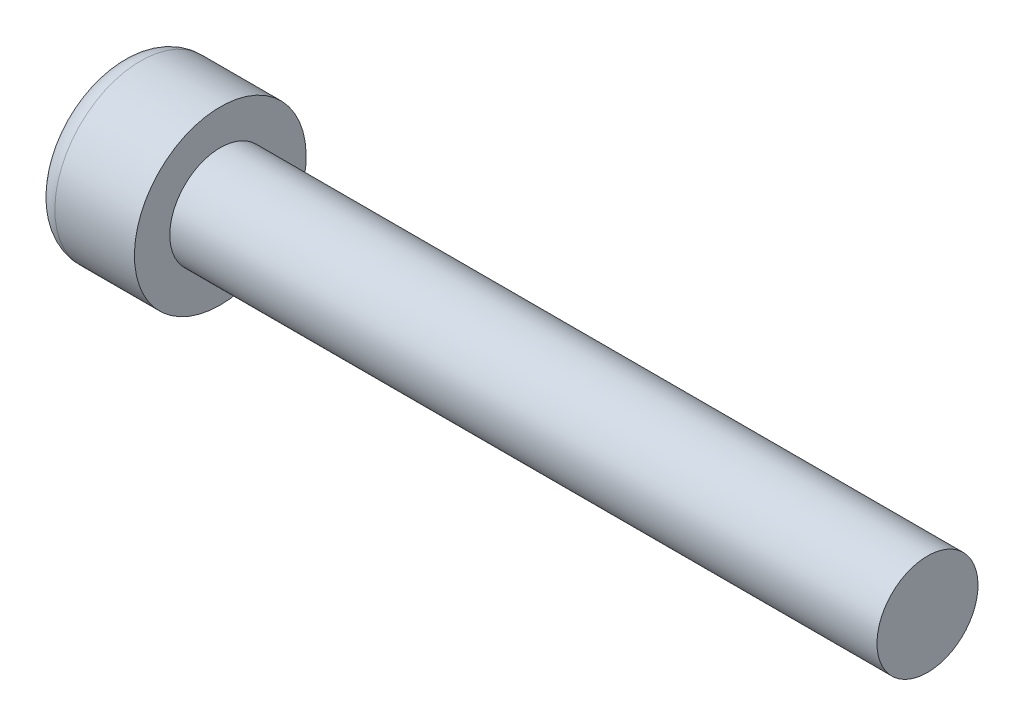
ISO-10303-21;
HEADER;
FILE_DESCRIPTION(('STEP AP214'),'2;1');
FILE_NAME('part.step','',(''),(''),'','','');
FILE_SCHEMA(('AUTOMOTIVE_DESIGN { 1 0 10303 214 1 1 1 1 }'));
ENDSEC;
DATA;
#1=APPLICATION_CONTEXT('core data for automotive mechanical design processes');
#2=APPLICATION_PROTOCOL_DEFINITION('international standard','automotive_design',2000,#1);
#3=PRODUCT_CONTEXT('',#1,'mechanical');
#4=PRODUCT('Part','Part','',(#3));
#5=PRODUCT_RELATED_PRODUCT_CATEGORY('part','',(#4));
#6=PRODUCT_DEFINITION_FORMATION('','',#4);
#7=PRODUCT_DEFINITION_CONTEXT('part definition',#1,'design');
#8=PRODUCT_DEFINITION('design','',#6,#7);
#9=PRODUCT_DEFINITION_SHAPE('','',#8);
#10=(LENGTH_UNIT() NAMED_UNIT(*) SI_UNIT(.MILLI.,.METRE.));
#11=(NAMED_UNIT(*) PLANE_ANGLE_UNIT() SI_UNIT($,.RADIAN.));
#12=(NAMED_UNIT(*) SI_UNIT($,.STERADIAN.) SOLID_ANGLE_UNIT());
#13=UNCERTAINTY_MEASURE_WITH_UNIT(LENGTH_MEASURE(1.E-05),#10,'distance_accuracy_value','');
#14=(GEOMETRIC_REPRESENTATION_CONTEXT(3) GLOBAL_UNCERTAINTY_ASSIGNED_CONTEXT((#13)) GLOBAL_UNIT_ASSIGNED_CONTEXT((#10,
#11,#12)) REPRESENTATION_CONTEXT('',''));
#15=CARTESIAN_POINT('',(0.,0.,0.));
#16=DIRECTION('',(0.,0.,1.));
#17=DIRECTION('',(1.,0.,0.));
#18=AXIS2_PLACEMENT_3D('',#15,#16,#17);
#19=CARTESIAN_POINT('',(0.,0.,0.));
#20=DIRECTION('',(1.,0.,0.));
#21=DIRECTION('',(0.,1.,0.));
#22=AXIS2_PLACEMENT_3D('',#19,#20,#21);
#23=PLANE('',#22);
#24=DIRECTION('',(0.,-0.5,-0.866025403784439));
#25=VECTOR('',#24,1.);
#26=CARTESIAN_POINT('',(0.,2.3094010767585,0.));
#27=LINE('',#26,#25);
#28=CARTESIAN_POINT('',(0.,2.3094010767585,0.));
#29=VERTEX_POINT('',#28);
#30=CARTESIAN_POINT('',(0.,1.15470053837925,-2.));
#31=VERTEX_POINT('',#30);
#32=EDGE_CURVE('E121',#29,#31,#27,.T.);
#33=ORIENTED_EDGE('',*,*,#32,.F.);
#34=DIRECTION('',(0.,0.5,-0.866025403784439));
#35=VECTOR('',#34,1.);
#36=CARTESIAN_POINT('',(0.,1.15470053837925,2.));
#37=LINE('',#36,#35);
#38=CARTESIAN_POINT('',(0.,1.15470053837925,2.));
#39=VERTEX_POINT('',#38);
#40=EDGE_CURVE('E47',#39,#29,#37,.T.);
#41=ORIENTED_EDGE('',*,*,#40,.F.);
#42=DIRECTION('',(0.,1.,0.));
#43=VECTOR('',#42,1.);
#44=CARTESIAN_POINT('',(0.,-1.15470053837925,2.));
#45=LINE('',#44,#43);
#46=CARTESIAN_POINT('',(0.,-1.15470053837925,2.));
#47=VERTEX_POINT('',#46);
#48=EDGE_CURVE('E130',#47,#39,#45,.T.);
#49=ORIENTED_EDGE('',*,*,#48,.F.);
#50=DIRECTION('',(0.,0.5,0.866025403784439));
#51=VECTOR('',#50,1.);
#52=CARTESIAN_POINT('',(0.,-2.3094010767585,0.));
#53=LINE('',#52,#51);
#54=CARTESIAN_POINT('',(0.,-2.3094010767585,0.));
#55=VERTEX_POINT('',#54);
#56=EDGE_CURVE('E128',#55,#47,#53,.T.);
#57=ORIENTED_EDGE('',*,*,#56,.F.);
#58=DIRECTION('',(0.,-0.5,0.866025403784439));
#59=VECTOR('',#58,1.);
#60=CARTESIAN_POINT('',(0.,-1.15470053837925,-2.));
#61=LINE('',#60,#59);
#62=CARTESIAN_POINT('',(0.,-1.15470053837925,-2.));
#63=VERTEX_POINT('',#62);
#64=EDGE_CURVE('E95',#63,#55,#61,.T.);
#65=ORIENTED_EDGE('',*,*,#64,.F.);
#66=DIRECTION('',(0.,-1.,0.));
#67=VECTOR('',#66,1.);
#68=CARTESIAN_POINT('',(0.,1.15470053837925,-2.));
#69=LINE('',#68,#67);
#70=EDGE_CURVE('E124',#31,#63,#69,.T.);
#71=ORIENTED_EDGE('',*,*,#70,.F.);
#72=EDGE_LOOP('',(#33,#41,#49,#57,#65,#71));
#73=FACE_BOUND('',#72,.T.);
#74=CARTESIAN_POINT('',(0.,0.,0.));
#75=DIRECTION('',(-1.,0.,0.));
#76=DIRECTION('',(0.,-1.,0.));
#77=AXIS2_PLACEMENT_3D('',#74,#75,#76);
#78=CIRCLE('',#77,3.1875);
#79=CARTESIAN_POINT('',(0.,-3.1875,0.));
#80=VERTEX_POINT('',#79);
#81=EDGE_CURVE('E11',#80,#80,#78,.T.);
#82=ORIENTED_EDGE('',*,*,#81,.T.);
#83=EDGE_LOOP('',(#82));
#84=FACE_BOUND('',#83,.T.);
#85=ADVANCED_FACE('F33',(#73,#84),#23,.F.);
#86=CARTESIAN_POINT('',(1.0625,0.,0.));
#87=DIRECTION('',(-1.,0.,0.));
#88=DIRECTION('',(0.,-1.,0.));
#89=AXIS2_PLACEMENT_3D('',#86,#87,#88);
#90=TOROIDAL_SURFACE('',#89,3.1875,1.0625);
#91=ORIENTED_EDGE('',*,*,#81,.F.);
#92=EDGE_LOOP('',(#91));
#93=FACE_BOUND('',#92,.T.);
#94=CARTESIAN_POINT('',(1.0625,0.,0.));
#95=DIRECTION('',(-1.,0.,0.));
#96=DIRECTION('',(0.,-1.,0.));
#97=AXIS2_PLACEMENT_3D('',#94,#95,#96);
#98=CIRCLE('',#97,4.25);
#99=CARTESIAN_POINT('',(1.0625,-4.25,0.));
#100=VERTEX_POINT('',#99);
#101=EDGE_CURVE('E40',#100,#100,#98,.T.);
#102=ORIENTED_EDGE('',*,*,#101,.T.);
#103=EDGE_LOOP('',(#102));
#104=FACE_BOUND('',#103,.T.);
#105=ADVANCED_FACE('F150',(#93,#104),#90,.T.);
#106=CARTESIAN_POINT('',(0.,0.,0.));
#107=DIRECTION('',(-1.,0.,0.));
#108=DIRECTION('',(0.,-1.,0.));
#109=AXIS2_PLACEMENT_3D('',#106,#107,#108);
#110=CYLINDRICAL_SURFACE('',#109,4.25);
#111=ORIENTED_EDGE('',*,*,#101,.F.);
#112=EDGE_LOOP('',(#111));
#113=FACE_BOUND('',#112,.T.);
#114=CARTESIAN_POINT('',(5.,0.,0.));
#115=DIRECTION('',(-1.,0.,0.));
#116=DIRECTION('',(0.,-1.,0.));
#117=AXIS2_PLACEMENT_3D('',#114,#115,#116);
#118=CIRCLE('',#117,4.25);
#119=CARTESIAN_POINT('',(5.,-4.25,0.));
#120=VERTEX_POINT('',#119);
#121=EDGE_CURVE('E145',#120,#120,#118,.T.);
#122=ORIENTED_EDGE('',*,*,#121,.T.);
#123=EDGE_LOOP('',(#122));
#124=FACE_BOUND('',#123,.T.);
#125=ADVANCED_FACE('F152',(#113,#124),#110,.T.);
#126=CARTESIAN_POINT('',(5.,4.25,0.));
#127=DIRECTION('',(-1.,0.,0.));
#128=DIRECTION('',(0.,-1.,0.));
#129=AXIS2_PLACEMENT_3D('',#126,#127,#128);
#130=PLANE('',#129);
#131=ORIENTED_EDGE('',*,*,#121,.F.);
#132=EDGE_LOOP('',(#131));
#133=FACE_BOUND('',#132,.T.);
#134=CARTESIAN_POINT('',(5.,0.,0.));
#135=DIRECTION('',(-1.,0.,0.));
#136=DIRECTION('',(0.,-1.,0.));
#137=AXIS2_PLACEMENT_3D('',#134,#135,#136);
#138=CIRCLE('',#137,2.5);
#139=CARTESIAN_POINT('',(5.,-2.5,0.));
#140=VERTEX_POINT('',#139);
#141=EDGE_CURVE('E142',#140,#140,#138,.T.);
#142=ORIENTED_EDGE('',*,*,#141,.T.);
#143=EDGE_LOOP('',(#142));
#144=FACE_BOUND('',#143,.T.);
#145=ADVANCED_FACE('F155',(#133,#144),#130,.F.);
#146=CARTESIAN_POINT('',(0.,0.,0.));
#147=DIRECTION('',(-1.,0.,0.));
#148=DIRECTION('',(0.,-1.,0.));
#149=AXIS2_PLACEMENT_3D('',#146,#147,#148);
#150=CYLINDRICAL_SURFACE('',#149,2.49999999999999);
#151=ORIENTED_EDGE('',*,*,#141,.F.);
#152=EDGE_LOOP('',(#151));
#153=FACE_BOUND('',#152,.T.);
#154=CARTESIAN_POINT('',(40.,0.,0.));
#155=DIRECTION('',(-1.,0.,0.));
#156=DIRECTION('',(0.,-1.,0.));
#157=AXIS2_PLACEMENT_3D('',#154,#155,#156);
#158=CIRCLE('',#157,2.49999999999999);
#159=CARTESIAN_POINT('',(40.,-2.49999999999999,0.));
#160=VERTEX_POINT('',#159);
#161=EDGE_CURVE('E134',#160,#160,#158,.T.);
#162=ORIENTED_EDGE('',*,*,#161,.T.);
#163=EDGE_LOOP('',(#162));
#164=FACE_BOUND('',#163,.T.);
#165=ADVANCED_FACE('F161',(#153,#164),#150,.T.);
#166=CARTESIAN_POINT('',(40.,2.5,0.));
#167=DIRECTION('',(-1.,0.,0.));
#168=DIRECTION('',(0.,-1.,0.));
#169=AXIS2_PLACEMENT_3D('',#166,#167,#168);
#170=PLANE('',#169);
#171=ORIENTED_EDGE('',*,*,#161,.F.);
#172=EDGE_LOOP('',(#171));
#173=FACE_BOUND('',#172,.T.);
#174=ADVANCED_FACE('F167',(#173),#170,.F.);
#175=CARTESIAN_POINT('',(2.5,1.15470053837925,2.));
#176=DIRECTION('',(0.,0.866025403784439,0.5));
#177=DIRECTION('',(0.,-0.5,0.866025403784439));
#178=AXIS2_PLACEMENT_3D('',#175,#176,#177);
#179=PLANE('',#178);
#180=ORIENTED_EDGE('',*,*,#40,.T.);
#181=DIRECTION('',(-1.,0.,0.));
#182=VECTOR('',#181,1.);
#183=CARTESIAN_POINT('',(2.5,2.3094010767585,0.));
#184=LINE('',#183,#182);
#185=CARTESIAN_POINT('',(2.5,2.3094010767585,0.));
#186=VERTEX_POINT('',#185);
#187=EDGE_CURVE('E77',#186,#29,#184,.T.);
#188=ORIENTED_EDGE('',*,*,#187,.F.);
#189=DIRECTION('',(0.,0.5,-0.866025403784439));
#190=VECTOR('',#189,1.);
#191=CARTESIAN_POINT('',(2.5,1.15470053837925,2.));
#192=LINE('',#191,#190);
#193=CARTESIAN_POINT('',(2.5,1.15470053837925,2.));
#194=VERTEX_POINT('',#193);
#195=EDGE_CURVE('E132',#194,#186,#192,.T.);
#196=ORIENTED_EDGE('',*,*,#195,.F.);
#197=DIRECTION('',(-1.,0.,0.));
#198=VECTOR('',#197,1.);
#199=CARTESIAN_POINT('',(2.5,1.15470053837925,2.));
#200=LINE('',#199,#198);
#201=EDGE_CURVE('E55',#194,#39,#200,.T.);
#202=ORIENTED_EDGE('',*,*,#201,.T.);
#203=EDGE_LOOP('',(#180,#188,#196,#202));
#204=FACE_BOUND('',#203,.T.);
#205=ADVANCED_FACE('F172',(#204),#179,.F.);
#206=CARTESIAN_POINT('',(2.5,-1.15470053837925,2.));
#207=DIRECTION('',(0.,0.,1.));
#208=DIRECTION('',(1.,0.,0.));
#209=AXIS2_PLACEMENT_3D('',#206,#207,#208);
#210=PLANE('',#209);
#211=ORIENTED_EDGE('',*,*,#48,.T.);
#212=ORIENTED_EDGE('',*,*,#201,.F.);
#213=DIRECTION('',(0.,1.,0.));
#214=VECTOR('',#213,1.);
#215=CARTESIAN_POINT('',(2.5,-1.15470053837925,2.));
#216=LINE('',#215,#214);
#217=CARTESIAN_POINT('',(2.5,-1.15470053837925,2.));
#218=VERTEX_POINT('',#217);
#219=EDGE_CURVE('E107',#218,#194,#216,.T.);
#220=ORIENTED_EDGE('',*,*,#219,.F.);
#221=DIRECTION('',(-1.,0.,0.));
#222=VECTOR('',#221,1.);
#223=CARTESIAN_POINT('',(2.5,-1.15470053837925,2.));
#224=LINE('',#223,#222);
#225=EDGE_CURVE('E99',#218,#47,#224,.T.);
#226=ORIENTED_EDGE('',*,*,#225,.T.);
#227=EDGE_LOOP('',(#211,#212,#220,#226));
#228=FACE_BOUND('',#227,.T.);
#229=ADVANCED_FACE('F177',(#228),#210,.F.);
#230=CARTESIAN_POINT('',(2.5,-2.3094010767585,0.));
#231=DIRECTION('',(0.,-0.866025403784439,0.5));
#232=DIRECTION('',(0.,-0.5,-0.866025403784439));
#233=AXIS2_PLACEMENT_3D('',#230,#231,#232);
#234=PLANE('',#233);
#235=ORIENTED_EDGE('',*,*,#56,.T.);
#236=ORIENTED_EDGE('',*,*,#225,.F.);
#237=DIRECTION('',(0.,0.5,0.866025403784439));
#238=VECTOR('',#237,1.);
#239=CARTESIAN_POINT('',(2.5,-2.3094010767585,0.));
#240=LINE('',#239,#238);
#241=CARTESIAN_POINT('',(2.5,-2.3094010767585,0.));
#242=VERTEX_POINT('',#241);
#243=EDGE_CURVE('E103',#242,#218,#240,.T.);
#244=ORIENTED_EDGE('',*,*,#243,.F.);
#245=DIRECTION('',(-1.,0.,0.));
#246=VECTOR('',#245,1.);
#247=CARTESIAN_POINT('',(2.5,-2.3094010767585,0.));
#248=LINE('',#247,#246);
#249=EDGE_CURVE('E88',#242,#55,#248,.T.);
#250=ORIENTED_EDGE('',*,*,#249,.T.);
#251=EDGE_LOOP('',(#235,#236,#244,#250));
#252=FACE_BOUND('',#251,.T.);
#253=ADVANCED_FACE('F104',(#252),#234,.F.);
#254=CARTESIAN_POINT('',(2.5,-1.15470053837925,-2.));
#255=DIRECTION('',(0.,-0.866025403784438,-0.5));
#256=DIRECTION('',(0.,0.5,-0.866025403784438));
#257=AXIS2_PLACEMENT_3D('',#254,#255,#256);
#258=PLANE('',#257);
#259=ORIENTED_EDGE('',*,*,#64,.T.);
#260=ORIENTED_EDGE('',*,*,#249,.F.);
#261=DIRECTION('',(0.,-0.5,0.866025403784439));
#262=VECTOR('',#261,1.);
#263=CARTESIAN_POINT('',(2.5,-1.15470053837925,-2.));
#264=LINE('',#263,#262);
#265=CARTESIAN_POINT('',(2.5,-1.15470053837925,-2.));
#266=VERTEX_POINT('',#265);
#267=EDGE_CURVE('E92',#266,#242,#264,.T.);
#268=ORIENTED_EDGE('',*,*,#267,.F.);
#269=DIRECTION('',(-1.,0.,0.));
#270=VECTOR('',#269,1.);
#271=CARTESIAN_POINT('',(2.5,-1.15470053837925,-2.));
#272=LINE('',#271,#270);
#273=EDGE_CURVE('E100',#266,#63,#272,.T.);
#274=ORIENTED_EDGE('',*,*,#273,.T.);
#275=EDGE_LOOP('',(#259,#260,#268,#274));
#276=FACE_BOUND('',#275,.T.);
#277=ADVANCED_FACE('F90',(#276),#258,.F.);
#278=CARTESIAN_POINT('',(2.5,1.15470053837925,-2.));
#279=DIRECTION('',(0.,0.,-1.));
#280=DIRECTION('',(-1.,0.,0.));
#281=AXIS2_PLACEMENT_3D('',#278,#279,#280);
#282=PLANE('',#281);
#283=ORIENTED_EDGE('',*,*,#70,.T.);
#284=ORIENTED_EDGE('',*,*,#273,.F.);
#285=DIRECTION('',(0.,-1.,0.));
#286=VECTOR('',#285,1.);
#287=CARTESIAN_POINT('',(2.5,1.15470053837925,-2.));
#288=LINE('',#287,#286);
#289=CARTESIAN_POINT('',(2.5,1.15470053837925,-2.));
#290=VERTEX_POINT('',#289);
#291=EDGE_CURVE('E113',#290,#266,#288,.T.);
#292=ORIENTED_EDGE('',*,*,#291,.F.);
#293=DIRECTION('',(-1.,0.,0.));
#294=VECTOR('',#293,1.);
#295=CARTESIAN_POINT('',(2.5,1.15470053837925,-2.));
#296=LINE('',#295,#294);
#297=EDGE_CURVE('E137',#290,#31,#296,.T.);
#298=ORIENTED_EDGE('',*,*,#297,.T.);
#299=EDGE_LOOP('',(#283,#284,#292,#298));
#300=FACE_BOUND('',#299,.T.);
#301=ADVANCED_FACE('F203',(#300),#282,.F.);
#302=CARTESIAN_POINT('',(2.5,2.3094010767585,0.));
#303=DIRECTION('',(0.,0.866025403784439,-0.5));
#304=DIRECTION('',(0.,0.5,0.866025403784439));
#305=AXIS2_PLACEMENT_3D('',#302,#303,#304);
#306=PLANE('',#305);
#307=ORIENTED_EDGE('',*,*,#32,.T.);
#308=ORIENTED_EDGE('',*,*,#297,.F.);
#309=DIRECTION('',(0.,-0.5,-0.866025403784439));
#310=VECTOR('',#309,1.);
#311=CARTESIAN_POINT('',(2.5,2.3094010767585,0.));
#312=LINE('',#311,#310);
#313=EDGE_CURVE('E115',#186,#290,#312,.T.);
#314=ORIENTED_EDGE('',*,*,#313,.F.);
#315=ORIENTED_EDGE('',*,*,#187,.T.);
#316=EDGE_LOOP('',(#307,#308,#314,#315));
#317=FACE_BOUND('',#316,.T.);
#318=ADVANCED_FACE('F191',(#317),#306,.F.);
#319=CARTESIAN_POINT('',(2.5,0.,0.));
#320=DIRECTION('',(-1.,0.,0.));
#321=DIRECTION('',(0.,-1.,0.));
#322=AXIS2_PLACEMENT_3D('',#319,#320,#321);
#323=PLANE('',#322);
#324=ORIENTED_EDGE('',*,*,#195,.T.);
#325=ORIENTED_EDGE('',*,*,#313,.T.);
#326=ORIENTED_EDGE('',*,*,#291,.T.);
#327=ORIENTED_EDGE('',*,*,#267,.T.);
#328=ORIENTED_EDGE('',*,*,#243,.T.);
#329=ORIENTED_EDGE('',*,*,#219,.T.);
#330=EDGE_LOOP('',(#324,#325,#326,#327,#328,#329));
#331=FACE_BOUND('',#330,.T.);
#332=ADVANCED_FACE('F110',(#331),#323,.T.);
#333=CLOSED_SHELL('',(#85,#105,#125,#145,#165,#174,#205,#229,#253,#277,#301,#318,#332));
#334=MANIFOLD_SOLID_BREP('B2',#333);
#335=ADVANCED_BREP_SHAPE_REPRESENTATION('',(#18,#334),#14);
#336=SHAPE_DEFINITION_REPRESENTATION(#9,#335);
ENDSEC;
END-ISO-10303-21;
